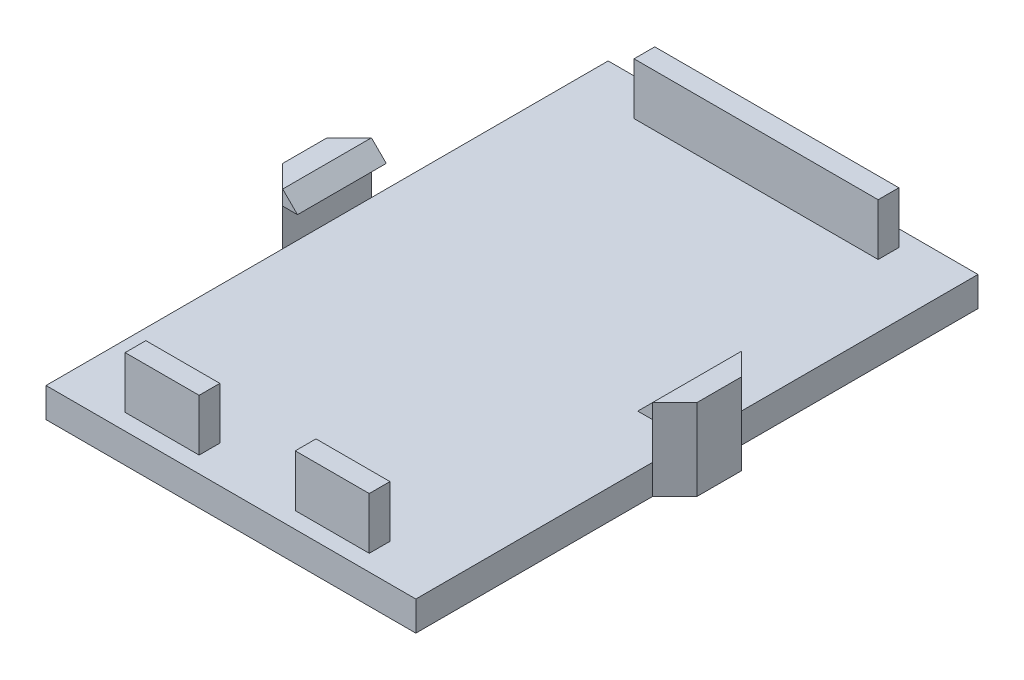
ISO-10303-21;
HEADER;
FILE_DESCRIPTION(('STEP AP214'),'2;1');
FILE_NAME('part.step','',(''),(''),'','','');
FILE_SCHEMA(('AUTOMOTIVE_DESIGN { 1 0 10303 214 1 1 1 1 }'));
ENDSEC;
DATA;
#1=APPLICATION_CONTEXT('core data for automotive mechanical design processes');
#2=APPLICATION_PROTOCOL_DEFINITION('international standard','automotive_design',2000,#1);
#3=PRODUCT_CONTEXT('',#1,'mechanical');
#4=PRODUCT('Part','Part','',(#3));
#5=PRODUCT_RELATED_PRODUCT_CATEGORY('part','',(#4));
#6=PRODUCT_DEFINITION_FORMATION('','',#4);
#7=PRODUCT_DEFINITION_CONTEXT('part definition',#1,'design');
#8=PRODUCT_DEFINITION('design','',#6,#7);
#9=PRODUCT_DEFINITION_SHAPE('','',#8);
#10=(LENGTH_UNIT() NAMED_UNIT(*) SI_UNIT(.MILLI.,.METRE.));
#11=(NAMED_UNIT(*) PLANE_ANGLE_UNIT() SI_UNIT($,.RADIAN.));
#12=(NAMED_UNIT(*) SI_UNIT($,.STERADIAN.) SOLID_ANGLE_UNIT());
#13=UNCERTAINTY_MEASURE_WITH_UNIT(LENGTH_MEASURE(1.E-05),#10,'distance_accuracy_value','');
#14=(GEOMETRIC_REPRESENTATION_CONTEXT(3) GLOBAL_UNCERTAINTY_ASSIGNED_CONTEXT((#13)) GLOBAL_UNIT_ASSIGNED_CONTEXT((#10,
#11,#12)) REPRESENTATION_CONTEXT('',''));
#15=CARTESIAN_POINT('',(0.,0.,0.));
#16=DIRECTION('',(0.,0.,1.));
#17=DIRECTION('',(1.,0.,0.));
#18=AXIS2_PLACEMENT_3D('',#15,#16,#17);
#19=CARTESIAN_POINT('',(0.,5.5,16.5));
#20=DIRECTION('',(0.,0.,-1.));
#21=DIRECTION('',(-1.,0.,0.));
#22=AXIS2_PLACEMENT_3D('',#19,#20,#21);
#23=PLANE('',#22);
#24=DIRECTION('',(1.,0.,0.));
#25=VECTOR('',#24,1.);
#26=CARTESIAN_POINT('',(0.,2.,16.5));
#27=LINE('',#26,#25);
#28=CARTESIAN_POINT('',(3.25,2.,16.5));
#29=VERTEX_POINT('',#28);
#30=CARTESIAN_POINT('',(8.25,2.,16.5));
#31=VERTEX_POINT('',#30);
#32=EDGE_CURVE('E448',#29,#31,#27,.T.);
#33=ORIENTED_EDGE('',*,*,#32,.F.);
#34=DIRECTION('',(0.,-1.,0.));
#35=VECTOR('',#34,1.);
#36=CARTESIAN_POINT('',(3.25,12.1490600839517,16.5));
#37=LINE('',#36,#35);
#38=CARTESIAN_POINT('',(3.25,5.5,16.5));
#39=VERTEX_POINT('',#38);
#40=EDGE_CURVE('E580',#39,#29,#37,.T.);
#41=ORIENTED_EDGE('',*,*,#40,.F.);
#42=DIRECTION('',(1.,0.,0.));
#43=VECTOR('',#42,1.);
#44=CARTESIAN_POINT('',(0.,5.5,16.5));
#45=LINE('',#44,#43);
#46=CARTESIAN_POINT('',(8.25,5.5,16.5));
#47=VERTEX_POINT('',#46);
#48=EDGE_CURVE('E568',#39,#47,#45,.T.);
#49=ORIENTED_EDGE('',*,*,#48,.T.);
#50=DIRECTION('',(0.,-1.,0.));
#51=VECTOR('',#50,1.);
#52=CARTESIAN_POINT('',(8.25,5.5,16.5));
#53=LINE('',#52,#51);
#54=EDGE_CURVE('E278',#47,#31,#53,.T.);
#55=ORIENTED_EDGE('',*,*,#54,.T.);
#56=EDGE_LOOP('',(#33,#41,#49,#55));
#57=FACE_BOUND('',#56,.T.);
#58=ADVANCED_FACE('F46',(#57),#23,.T.);
#59=CARTESIAN_POINT('',(-8.25,5.5,16.5));
#60=VERTEX_POINT('',#59);
#61=CARTESIAN_POINT('',(-3.25,5.5,16.5));
#62=VERTEX_POINT('',#61);
#63=EDGE_CURVE('E570',#60,#62,#45,.T.);
#64=ORIENTED_EDGE('',*,*,#63,.T.);
#65=DIRECTION('',(0.,-1.,0.));
#66=VECTOR('',#65,1.);
#67=CARTESIAN_POINT('',(-3.25,12.1490600839517,16.5));
#68=LINE('',#67,#66);
#69=CARTESIAN_POINT('',(-3.25,2.,16.5));
#70=VERTEX_POINT('',#69);
#71=EDGE_CURVE('E66',#62,#70,#68,.T.);
#72=ORIENTED_EDGE('',*,*,#71,.T.);
#73=CARTESIAN_POINT('',(-8.25,2.,16.5));
#74=VERTEX_POINT('',#73);
#75=EDGE_CURVE('E449',#74,#70,#27,.T.);
#76=ORIENTED_EDGE('',*,*,#75,.F.);
#77=DIRECTION('',(0.,-1.,0.));
#78=VECTOR('',#77,1.);
#79=CARTESIAN_POINT('',(-8.25,5.5,16.5));
#80=LINE('',#79,#78);
#81=EDGE_CURVE('E293',#60,#74,#80,.T.);
#82=ORIENTED_EDGE('',*,*,#81,.F.);
#83=EDGE_LOOP('',(#64,#72,#76,#82));
#84=FACE_BOUND('',#83,.T.);
#85=ADVANCED_FACE('F662',(#84),#23,.T.);
#86=CARTESIAN_POINT('',(0.,5.5,17.9));
#87=DIRECTION('',(0.,0.,-1.));
#88=DIRECTION('',(-1.,0.,0.));
#89=AXIS2_PLACEMENT_3D('',#86,#87,#88);
#90=PLANE('',#89);
#91=DIRECTION('',(0.,-1.,0.));
#92=VECTOR('',#91,1.);
#93=CARTESIAN_POINT('',(3.25,12.1490600839517,17.9));
#94=LINE('',#93,#92);
#95=CARTESIAN_POINT('',(3.25,5.5,17.9));
#96=VERTEX_POINT('',#95);
#97=CARTESIAN_POINT('',(3.25,2.,17.9));
#98=VERTEX_POINT('',#97);
#99=EDGE_CURVE('E930',#96,#98,#94,.T.);
#100=ORIENTED_EDGE('',*,*,#99,.T.);
#101=DIRECTION('',(1.,0.,0.));
#102=VECTOR('',#101,1.);
#103=CARTESIAN_POINT('',(0.,2.,17.9));
#104=LINE('',#103,#102);
#105=CARTESIAN_POINT('',(8.25,2.,17.9));
#106=VERTEX_POINT('',#105);
#107=EDGE_CURVE('E457',#98,#106,#104,.T.);
#108=ORIENTED_EDGE('',*,*,#107,.T.);
#109=DIRECTION('',(0.,-1.,0.));
#110=VECTOR('',#109,1.);
#111=CARTESIAN_POINT('',(8.25,5.5,17.9));
#112=LINE('',#111,#110);
#113=CARTESIAN_POINT('',(8.25,5.5,17.9));
#114=VERTEX_POINT('',#113);
#115=EDGE_CURVE('E286',#114,#106,#112,.T.);
#116=ORIENTED_EDGE('',*,*,#115,.F.);
#117=DIRECTION('',(1.,0.,0.));
#118=VECTOR('',#117,1.);
#119=CARTESIAN_POINT('',(0.,5.5,17.9));
#120=LINE('',#119,#118);
#121=EDGE_CURVE('E273',#96,#114,#120,.T.);
#122=ORIENTED_EDGE('',*,*,#121,.F.);
#123=EDGE_LOOP('',(#100,#108,#116,#122));
#124=FACE_BOUND('',#123,.T.);
#125=ADVANCED_FACE('F592',(#124),#90,.F.);
#126=DIRECTION('',(0.,-1.,0.));
#127=VECTOR('',#126,1.);
#128=CARTESIAN_POINT('',(-3.25,12.1490600839517,17.9));
#129=LINE('',#128,#127);
#130=CARTESIAN_POINT('',(-3.25,5.5,17.9));
#131=VERTEX_POINT('',#130);
#132=CARTESIAN_POINT('',(-3.25,2.,17.9));
#133=VERTEX_POINT('',#132);
#134=EDGE_CURVE('E246',#131,#133,#129,.T.);
#135=ORIENTED_EDGE('',*,*,#134,.F.);
#136=CARTESIAN_POINT('',(-8.25,5.5,17.9));
#137=VERTEX_POINT('',#136);
#138=EDGE_CURVE('E261',#137,#131,#120,.T.);
#139=ORIENTED_EDGE('',*,*,#138,.F.);
#140=DIRECTION('',(0.,-1.,0.));
#141=VECTOR('',#140,1.);
#142=CARTESIAN_POINT('',(-8.25,5.5,17.9));
#143=LINE('',#142,#141);
#144=CARTESIAN_POINT('',(-8.25,2.,17.9));
#145=VERTEX_POINT('',#144);
#146=EDGE_CURVE('E290',#137,#145,#143,.T.);
#147=ORIENTED_EDGE('',*,*,#146,.T.);
#148=EDGE_CURVE('E263',#145,#133,#104,.T.);
#149=ORIENTED_EDGE('',*,*,#148,.T.);
#150=EDGE_LOOP('',(#135,#139,#147,#149));
#151=FACE_BOUND('',#150,.T.);
#152=ADVANCED_FACE('F259',(#151),#90,.F.);
#153=CARTESIAN_POINT('',(0.,5.5,0.));
#154=DIRECTION('',(0.,1.,0.));
#155=DIRECTION('',(0.,0.,1.));
#156=AXIS2_PLACEMENT_3D('',#153,#154,#155);
#157=PLANE('',#156);
#158=ORIENTED_EDGE('',*,*,#48,.F.);
#159=DIRECTION('',(0.,0.,-1.));
#160=VECTOR('',#159,1.);
#161=CARTESIAN_POINT('',(3.25,5.5,17.9));
#162=LINE('',#161,#160);
#163=EDGE_CURVE('E254',#96,#39,#162,.T.);
#164=ORIENTED_EDGE('',*,*,#163,.F.);
#165=ORIENTED_EDGE('',*,*,#121,.T.);
#166=DIRECTION('',(0.,0.,1.));
#167=VECTOR('',#166,1.);
#168=CARTESIAN_POINT('',(8.25,5.5,0.));
#169=LINE('',#168,#167);
#170=EDGE_CURVE('E272',#47,#114,#169,.T.);
#171=ORIENTED_EDGE('',*,*,#170,.F.);
#172=EDGE_LOOP('',(#158,#164,#165,#171));
#173=FACE_BOUND('',#172,.T.);
#174=ADVANCED_FACE('F587',(#173),#157,.T.);
#175=ORIENTED_EDGE('',*,*,#138,.T.);
#176=DIRECTION('',(0.,0.,1.));
#177=VECTOR('',#176,1.);
#178=CARTESIAN_POINT('',(-3.25,5.5,17.9));
#179=LINE('',#178,#177);
#180=EDGE_CURVE('E243',#62,#131,#179,.T.);
#181=ORIENTED_EDGE('',*,*,#180,.F.);
#182=ORIENTED_EDGE('',*,*,#63,.F.);
#183=DIRECTION('',(0.,0.,1.));
#184=VECTOR('',#183,1.);
#185=CARTESIAN_POINT('',(-8.25,5.5,0.));
#186=LINE('',#185,#184);
#187=EDGE_CURVE('E269',#60,#137,#186,.T.);
#188=ORIENTED_EDGE('',*,*,#187,.T.);
#189=EDGE_LOOP('',(#175,#181,#182,#188));
#190=FACE_BOUND('',#189,.T.);
#191=ADVANCED_FACE('F267',(#190),#157,.T.);
#192=CARTESIAN_POINT('',(-12.5,5.5,0.));
#193=DIRECTION('',(-1.,0.,0.));
#194=DIRECTION('',(0.,0.,1.));
#195=AXIS2_PLACEMENT_3D('',#192,#193,#194);
#196=PLANE('',#195);
#197=DIRECTION('',(0.,0.,-1.));
#198=VECTOR('',#197,1.);
#199=CARTESIAN_POINT('',(-12.5,4.5,2.99999999999999));
#200=LINE('',#199,#198);
#201=CARTESIAN_POINT('',(-12.5,4.5,2.99999999999999));
#202=VERTEX_POINT('',#201);
#203=CARTESIAN_POINT('',(-12.5,4.5,-3.));
#204=VERTEX_POINT('',#203);
#205=EDGE_CURVE('E253',#202,#204,#200,.T.);
#206=ORIENTED_EDGE('',*,*,#205,.F.);
#207=DIRECTION('',(0.,-1.,0.));
#208=VECTOR('',#207,1.);
#209=CARTESIAN_POINT('',(-12.5,5.5,2.99999999999999));
#210=LINE('',#209,#208);
#211=CARTESIAN_POINT('',(-12.5,2.,2.99999999999999));
#212=VERTEX_POINT('',#211);
#213=EDGE_CURVE('E382',#202,#212,#210,.T.);
#214=ORIENTED_EDGE('',*,*,#213,.T.);
#215=DIRECTION('',(0.,0.,-1.));
#216=VECTOR('',#215,1.);
#217=CARTESIAN_POINT('',(-12.5,2.,0.));
#218=LINE('',#217,#216);
#219=CARTESIAN_POINT('',(-12.5,2.,-2.99999999999999));
#220=VERTEX_POINT('',#219);
#221=EDGE_CURVE('E445',#212,#220,#218,.T.);
#222=ORIENTED_EDGE('',*,*,#221,.T.);
#223=DIRECTION('',(0.,-1.,0.));
#224=VECTOR('',#223,1.);
#225=CARTESIAN_POINT('',(-12.5,5.5,-2.99999999999999));
#226=LINE('',#225,#224);
#227=EDGE_CURVE('E403',#204,#220,#226,.T.);
#228=ORIENTED_EDGE('',*,*,#227,.F.);
#229=EDGE_LOOP('',(#206,#214,#222,#228));
#230=FACE_BOUND('',#229,.T.);
#231=ADVANCED_FACE('F503',(#230),#196,.F.);
#232=CARTESIAN_POINT('',(12.5,5.5,0.));
#233=DIRECTION('',(-1.,0.,0.));
#234=DIRECTION('',(0.,0.,1.));
#235=AXIS2_PLACEMENT_3D('',#232,#233,#234);
#236=PLANE('',#235);
#237=DIRECTION('',(0.,-1.,0.));
#238=VECTOR('',#237,1.);
#239=CARTESIAN_POINT('',(12.5,5.5,2.99999999999999));
#240=LINE('',#239,#238);
#241=CARTESIAN_POINT('',(12.5,4.5,2.99999999999999));
#242=VERTEX_POINT('',#241);
#243=CARTESIAN_POINT('',(12.5,2.,2.99999999999999));
#244=VERTEX_POINT('',#243);
#245=EDGE_CURVE('E59',#242,#244,#240,.T.);
#246=ORIENTED_EDGE('',*,*,#245,.F.);
#247=DIRECTION('',(0.,0.,-1.));
#248=VECTOR('',#247,1.);
#249=CARTESIAN_POINT('',(12.5,4.5,2.99999999999999));
#250=LINE('',#249,#248);
#251=CARTESIAN_POINT('',(12.5,4.5,-3.));
#252=VERTEX_POINT('',#251);
#253=EDGE_CURVE('E559',#242,#252,#250,.T.);
#254=ORIENTED_EDGE('',*,*,#253,.T.);
#255=DIRECTION('',(0.,-1.,0.));
#256=VECTOR('',#255,1.);
#257=CARTESIAN_POINT('',(12.5,5.5,-3.));
#258=LINE('',#257,#256);
#259=CARTESIAN_POINT('',(12.5,2.,-3.));
#260=VERTEX_POINT('',#259);
#261=EDGE_CURVE('E344',#252,#260,#258,.T.);
#262=ORIENTED_EDGE('',*,*,#261,.T.);
#263=DIRECTION('',(0.,0.,-1.));
#264=VECTOR('',#263,1.);
#265=CARTESIAN_POINT('',(12.5,2.,0.));
#266=LINE('',#265,#264);
#267=EDGE_CURVE('E435',#244,#260,#266,.T.);
#268=ORIENTED_EDGE('',*,*,#267,.F.);
#269=EDGE_LOOP('',(#246,#254,#262,#268));
#270=FACE_BOUND('',#269,.T.);
#271=ADVANCED_FACE('F701',(#270),#236,.T.);
#272=CARTESIAN_POINT('',(12.5,2.,0.));
#273=DIRECTION('',(-1.,0.,0.));
#274=DIRECTION('',(0.,0.,1.));
#275=AXIS2_PLACEMENT_3D('',#272,#273,#274);
#276=PLANE('',#275);
#277=CARTESIAN_POINT('',(12.5,0.,2.99999999999999));
#278=VERTEX_POINT('',#277);
#279=EDGE_CURVE('E11',#244,#278,#240,.T.);
#280=ORIENTED_EDGE('',*,*,#279,.F.);
#281=CARTESIAN_POINT('',(12.5,2.,19.));
#282=VERTEX_POINT('',#281);
#283=EDGE_CURVE('E430',#282,#244,#266,.T.);
#284=ORIENTED_EDGE('',*,*,#283,.F.);
#285=DIRECTION('',(0.,-1.,0.));
#286=VECTOR('',#285,1.);
#287=CARTESIAN_POINT('',(12.5,2.,19.));
#288=LINE('',#287,#286);
#289=CARTESIAN_POINT('',(12.5,0.,19.));
#290=VERTEX_POINT('',#289);
#291=EDGE_CURVE('E50',#282,#290,#288,.T.);
#292=ORIENTED_EDGE('',*,*,#291,.T.);
#293=DIRECTION('',(0.,0.,-1.));
#294=VECTOR('',#293,1.);
#295=CARTESIAN_POINT('',(12.5,0.,0.));
#296=LINE('',#295,#294);
#297=EDGE_CURVE('E465',#290,#278,#296,.T.);
#298=ORIENTED_EDGE('',*,*,#297,.T.);
#299=EDGE_LOOP('',(#280,#284,#292,#298));
#300=FACE_BOUND('',#299,.T.);
#301=ADVANCED_FACE('F523',(#300),#276,.F.);
#302=CARTESIAN_POINT('',(-12.5,2.,0.));
#303=DIRECTION('',(-1.,0.,0.));
#304=DIRECTION('',(0.,0.,1.));
#305=AXIS2_PLACEMENT_3D('',#302,#303,#304);
#306=PLANE('',#305);
#307=CARTESIAN_POINT('',(-12.5,2.,19.));
#308=VERTEX_POINT('',#307);
#309=EDGE_CURVE('E440',#308,#212,#218,.T.);
#310=ORIENTED_EDGE('',*,*,#309,.T.);
#311=CARTESIAN_POINT('',(-12.5,0.,2.99999999999999));
#312=VERTEX_POINT('',#311);
#313=EDGE_CURVE('E396',#212,#312,#210,.T.);
#314=ORIENTED_EDGE('',*,*,#313,.T.);
#315=DIRECTION('',(0.,0.,-1.));
#316=VECTOR('',#315,1.);
#317=CARTESIAN_POINT('',(-12.5,0.,0.));
#318=LINE('',#317,#316);
#319=CARTESIAN_POINT('',(-12.5,0.,19.));
#320=VERTEX_POINT('',#319);
#321=EDGE_CURVE('E414',#320,#312,#318,.T.);
#322=ORIENTED_EDGE('',*,*,#321,.F.);
#323=DIRECTION('',(0.,-1.,0.));
#324=VECTOR('',#323,1.);
#325=CARTESIAN_POINT('',(-12.5,2.,19.));
#326=LINE('',#325,#324);
#327=EDGE_CURVE('E460',#308,#320,#326,.T.);
#328=ORIENTED_EDGE('',*,*,#327,.F.);
#329=EDGE_LOOP('',(#310,#314,#322,#328));
#330=FACE_BOUND('',#329,.T.);
#331=ADVANCED_FACE('F517',(#330),#306,.T.);
#332=CARTESIAN_POINT('',(0.,2.,19.));
#333=DIRECTION('',(0.,0.,-1.));
#334=DIRECTION('',(-1.,0.,0.));
#335=AXIS2_PLACEMENT_3D('',#332,#333,#334);
#336=PLANE('',#335);
#337=DIRECTION('',(1.,0.,0.));
#338=VECTOR('',#337,1.);
#339=CARTESIAN_POINT('',(0.,0.,19.));
#340=LINE('',#339,#338);
#341=EDGE_CURVE('E408',#320,#290,#340,.T.);
#342=ORIENTED_EDGE('',*,*,#341,.T.);
#343=ORIENTED_EDGE('',*,*,#291,.F.);
#344=DIRECTION('',(1.,0.,0.));
#345=VECTOR('',#344,1.);
#346=CARTESIAN_POINT('',(0.,2.,19.));
#347=LINE('',#346,#345);
#348=EDGE_CURVE('E425',#308,#282,#347,.T.);
#349=ORIENTED_EDGE('',*,*,#348,.F.);
#350=ORIENTED_EDGE('',*,*,#327,.T.);
#351=EDGE_LOOP('',(#342,#343,#349,#350));
#352=FACE_BOUND('',#351,.T.);
#353=ADVANCED_FACE('F48',(#352),#336,.F.);
#354=CARTESIAN_POINT('',(12.5,2.,-19.));
#355=VERTEX_POINT('',#354);
#356=EDGE_CURVE('E429',#260,#355,#266,.T.);
#357=ORIENTED_EDGE('',*,*,#356,.F.);
#358=CARTESIAN_POINT('',(12.5,0.,-3.));
#359=VERTEX_POINT('',#358);
#360=EDGE_CURVE('E56',#260,#359,#258,.T.);
#361=ORIENTED_EDGE('',*,*,#360,.T.);
#362=CARTESIAN_POINT('',(12.5,0.,-19.));
#363=VERTEX_POINT('',#362);
#364=EDGE_CURVE('E464',#359,#363,#296,.T.);
#365=ORIENTED_EDGE('',*,*,#364,.T.);
#366=DIRECTION('',(0.,-1.,0.));
#367=VECTOR('',#366,1.);
#368=CARTESIAN_POINT('',(12.5,2.,-19.));
#369=LINE('',#368,#367);
#370=EDGE_CURVE('E482',#355,#363,#369,.T.);
#371=ORIENTED_EDGE('',*,*,#370,.F.);
#372=EDGE_LOOP('',(#357,#361,#365,#371));
#373=FACE_BOUND('',#372,.T.);
#374=ADVANCED_FACE('F642',(#373),#276,.F.);
#375=CARTESIAN_POINT('',(0.,2.,-19.));
#376=DIRECTION('',(0.,0.,-1.));
#377=DIRECTION('',(-1.,0.,0.));
#378=AXIS2_PLACEMENT_3D('',#375,#376,#377);
#379=PLANE('',#378);
#380=DIRECTION('',(1.,0.,0.));
#381=VECTOR('',#380,1.);
#382=CARTESIAN_POINT('',(0.,0.,-19.));
#383=LINE('',#382,#381);
#384=CARTESIAN_POINT('',(-12.5,0.,-19.));
#385=VERTEX_POINT('',#384);
#386=EDGE_CURVE('E469',#385,#363,#383,.T.);
#387=ORIENTED_EDGE('',*,*,#386,.F.);
#388=DIRECTION('',(0.,-1.,0.));
#389=VECTOR('',#388,1.);
#390=CARTESIAN_POINT('',(-12.5,2.,-19.));
#391=LINE('',#390,#389);
#392=CARTESIAN_POINT('',(-12.5,2.,-19.));
#393=VERTEX_POINT('',#392);
#394=EDGE_CURVE('E479',#393,#385,#391,.T.);
#395=ORIENTED_EDGE('',*,*,#394,.F.);
#396=DIRECTION('',(1.,0.,0.));
#397=VECTOR('',#396,1.);
#398=CARTESIAN_POINT('',(0.,2.,-19.));
#399=LINE('',#398,#397);
#400=EDGE_CURVE('E434',#393,#355,#399,.T.);
#401=ORIENTED_EDGE('',*,*,#400,.T.);
#402=ORIENTED_EDGE('',*,*,#370,.T.);
#403=EDGE_LOOP('',(#387,#395,#401,#402));
#404=FACE_BOUND('',#403,.T.);
#405=ADVANCED_FACE('F645',(#404),#379,.T.);
#406=CARTESIAN_POINT('',(-12.5,0.,-2.99999999999999));
#407=VERTEX_POINT('',#406);
#408=EDGE_CURVE('E409',#220,#407,#226,.T.);
#409=ORIENTED_EDGE('',*,*,#408,.F.);
#410=EDGE_CURVE('E439',#220,#393,#218,.T.);
#411=ORIENTED_EDGE('',*,*,#410,.T.);
#412=ORIENTED_EDGE('',*,*,#394,.T.);
#413=EDGE_CURVE('E473',#407,#385,#318,.T.);
#414=ORIENTED_EDGE('',*,*,#413,.F.);
#415=EDGE_LOOP('',(#409,#411,#412,#414));
#416=FACE_BOUND('',#415,.T.);
#417=ADVANCED_FACE('F647',(#416),#306,.T.);
#418=CARTESIAN_POINT('',(0.,2.,0.));
#419=DIRECTION('',(0.,1.,0.));
#420=DIRECTION('',(0.,0.,1.));
#421=AXIS2_PLACEMENT_3D('',#418,#419,#420);
#422=PLANE('',#421);
#423=ORIENTED_EDGE('',*,*,#75,.T.);
#424=DIRECTION('',(0.,0.,1.));
#425=VECTOR('',#424,1.);
#426=CARTESIAN_POINT('',(-3.25,2.,17.9));
#427=LINE('',#426,#425);
#428=EDGE_CURVE('E265',#70,#133,#427,.T.);
#429=ORIENTED_EDGE('',*,*,#428,.T.);
#430=ORIENTED_EDGE('',*,*,#148,.F.);
#431=DIRECTION('',(0.,0.,1.));
#432=VECTOR('',#431,1.);
#433=CARTESIAN_POINT('',(-8.25,2.,0.));
#434=LINE('',#433,#432);
#435=EDGE_CURVE('E444',#74,#145,#434,.T.);
#436=ORIENTED_EDGE('',*,*,#435,.F.);
#437=EDGE_LOOP('',(#423,#429,#430,#436));
#438=FACE_BOUND('',#437,.T.);
#439=DIRECTION('',(0.,0.,-1.));
#440=VECTOR('',#439,1.);
#441=CARTESIAN_POINT('',(8.25,2.,0.));
#442=LINE('',#441,#440);
#443=CARTESIAN_POINT('',(8.25,2.,-16.5));
#444=VERTEX_POINT('',#443);
#445=CARTESIAN_POINT('',(8.25,2.,-17.9));
#446=VERTEX_POINT('',#445);
#447=EDGE_CURVE('E410',#444,#446,#442,.T.);
#448=ORIENTED_EDGE('',*,*,#447,.F.);
#449=DIRECTION('',(1.,0.,0.));
#450=VECTOR('',#449,1.);
#451=CARTESIAN_POINT('',(0.,2.,-16.5));
#452=LINE('',#451,#450);
#453=CARTESIAN_POINT('',(-8.25,2.,-16.5));
#454=VERTEX_POINT('',#453);
#455=EDGE_CURVE('E413',#454,#444,#452,.T.);
#456=ORIENTED_EDGE('',*,*,#455,.F.);
#457=DIRECTION('',(0.,0.,-1.));
#458=VECTOR('',#457,1.);
#459=CARTESIAN_POINT('',(-8.25,2.,0.));
#460=LINE('',#459,#458);
#461=CARTESIAN_POINT('',(-8.25,2.,-17.9));
#462=VERTEX_POINT('',#461);
#463=EDGE_CURVE('E417',#454,#462,#460,.T.);
#464=ORIENTED_EDGE('',*,*,#463,.T.);
#465=DIRECTION('',(1.,0.,0.));
#466=VECTOR('',#465,1.);
#467=CARTESIAN_POINT('',(0.,2.,-17.9));
#468=LINE('',#467,#466);
#469=EDGE_CURVE('E421',#462,#446,#468,.T.);
#470=ORIENTED_EDGE('',*,*,#469,.T.);
#471=EDGE_LOOP('',(#448,#456,#464,#470));
#472=FACE_BOUND('',#471,.T.);
#473=ORIENTED_EDGE('',*,*,#348,.T.);
#474=ORIENTED_EDGE('',*,*,#283,.T.);
#475=ORIENTED_EDGE('',*,*,#267,.T.);
#476=ORIENTED_EDGE('',*,*,#356,.T.);
#477=ORIENTED_EDGE('',*,*,#400,.F.);
#478=ORIENTED_EDGE('',*,*,#410,.F.);
#479=ORIENTED_EDGE('',*,*,#221,.F.);
#480=ORIENTED_EDGE('',*,*,#309,.F.);
#481=EDGE_LOOP('',(#473,#474,#475,#476,#477,#478,#479,#480));
#482=FACE_BOUND('',#481,.T.);
#483=DIRECTION('',(0.,0.,-1.));
#484=VECTOR('',#483,1.);
#485=CARTESIAN_POINT('',(3.25,2.,17.9));
#486=LINE('',#485,#484);
#487=EDGE_CURVE('E595',#98,#29,#486,.T.);
#488=ORIENTED_EDGE('',*,*,#487,.T.);
#489=ORIENTED_EDGE('',*,*,#32,.T.);
#490=DIRECTION('',(0.,0.,1.));
#491=VECTOR('',#490,1.);
#492=CARTESIAN_POINT('',(8.25,2.,0.));
#493=LINE('',#492,#491);
#494=EDGE_CURVE('E453',#31,#106,#493,.T.);
#495=ORIENTED_EDGE('',*,*,#494,.T.);
#496=ORIENTED_EDGE('',*,*,#107,.F.);
#497=EDGE_LOOP('',(#488,#489,#495,#496));
#498=FACE_BOUND('',#497,.T.);
#499=ADVANCED_FACE('F513',(#438,#472,#482,#498),#422,.T.);
#500=CARTESIAN_POINT('',(0.,0.,0.));
#501=DIRECTION('',(0.,1.,0.));
#502=DIRECTION('',(0.,0.,1.));
#503=AXIS2_PLACEMENT_3D('',#500,#501,#502);
#504=PLANE('',#503);
#505=ORIENTED_EDGE('',*,*,#341,.F.);
#506=ORIENTED_EDGE('',*,*,#321,.T.);
#507=DIRECTION('',(-0.707106781186544,0.,-0.707106781186551));
#508=VECTOR('',#507,1.);
#509=CARTESIAN_POINT('',(-7.75000000000006,0.,7.74999999999998));
#510=LINE('',#509,#508);
#511=CARTESIAN_POINT('',(-14.,0.,1.49999999999998));
#512=VERTEX_POINT('',#511);
#513=EDGE_CURVE('E372',#312,#512,#510,.T.);
#514=ORIENTED_EDGE('',*,*,#513,.T.);
#515=DIRECTION('',(0.,0.,1.));
#516=VECTOR('',#515,1.);
#517=CARTESIAN_POINT('',(-14.,0.,0.));
#518=LINE('',#517,#516);
#519=CARTESIAN_POINT('',(-14.,0.,-1.49999999999998));
#520=VERTEX_POINT('',#519);
#521=EDGE_CURVE('E385',#520,#512,#518,.T.);
#522=ORIENTED_EDGE('',*,*,#521,.F.);
#523=DIRECTION('',(-0.707106781186544,0.,0.707106781186551));
#524=VECTOR('',#523,1.);
#525=CARTESIAN_POINT('',(-7.75000000000007,0.,-7.74999999999998));
#526=LINE('',#525,#524);
#527=EDGE_CURVE('E366',#407,#520,#526,.T.);
#528=ORIENTED_EDGE('',*,*,#527,.F.);
#529=ORIENTED_EDGE('',*,*,#413,.T.);
#530=ORIENTED_EDGE('',*,*,#386,.T.);
#531=ORIENTED_EDGE('',*,*,#364,.F.);
#532=DIRECTION('',(0.707106781186544,0.,0.707106781186551));
#533=VECTOR('',#532,1.);
#534=CARTESIAN_POINT('',(7.75000000000007,0.,-7.74999999999998));
#535=LINE('',#534,#533);
#536=CARTESIAN_POINT('',(14.,0.,-1.49999999999998));
#537=VERTEX_POINT('',#536);
#538=EDGE_CURVE('E333',#359,#537,#535,.T.);
#539=ORIENTED_EDGE('',*,*,#538,.T.);
#540=DIRECTION('',(0.,0.,1.));
#541=VECTOR('',#540,1.);
#542=CARTESIAN_POINT('',(14.,0.,0.));
#543=LINE('',#542,#541);
#544=CARTESIAN_POINT('',(14.,0.,1.49999999999998));
#545=VERTEX_POINT('',#544);
#546=EDGE_CURVE('E348',#537,#545,#543,.T.);
#547=ORIENTED_EDGE('',*,*,#546,.T.);
#548=DIRECTION('',(0.707106781186544,0.,-0.707106781186551));
#549=VECTOR('',#548,1.);
#550=CARTESIAN_POINT('',(7.75000000000006,0.,7.74999999999998));
#551=LINE('',#550,#549);
#552=EDGE_CURVE('E327',#278,#545,#551,.T.);
#553=ORIENTED_EDGE('',*,*,#552,.F.);
#554=ORIENTED_EDGE('',*,*,#297,.F.);
#555=EDGE_LOOP('',(#505,#506,#514,#522,#528,#529,#530,#531,#539,#547,#553,#554));
#556=FACE_BOUND('',#555,.T.);
#557=ADVANCED_FACE('F529',(#556),#504,.F.);
#558=CARTESIAN_POINT('',(-7.75000000000007,5.5,-7.74999999999998));
#559=DIRECTION('',(0.707106781186551,0.,0.707106781186544));
#560=DIRECTION('',(0.707106781186544,0.,-0.707106781186551));
#561=AXIS2_PLACEMENT_3D('',#558,#559,#560);
#562=PLANE('',#561);
#563=ORIENTED_EDGE('',*,*,#527,.T.);
#564=DIRECTION('',(0.,-1.,0.));
#565=VECTOR('',#564,1.);
#566=CARTESIAN_POINT('',(-14.,5.5,-1.49999999999998));
#567=LINE('',#566,#565);
#568=CARTESIAN_POINT('',(-14.,5.5,-1.49999999999998));
#569=VERTEX_POINT('',#568);
#570=EDGE_CURVE('E399',#569,#520,#567,.T.);
#571=ORIENTED_EDGE('',*,*,#570,.F.);
#572=DIRECTION('',(-0.707106781186544,0.,0.707106781186551));
#573=VECTOR('',#572,1.);
#574=CARTESIAN_POINT('',(-7.75000000000007,5.5,-7.74999999999998));
#575=LINE('',#574,#573);
#576=CARTESIAN_POINT('',(-12.5,5.5,-2.99999999999999));
#577=VERTEX_POINT('',#576);
#578=EDGE_CURVE('E371',#577,#569,#575,.T.);
#579=ORIENTED_EDGE('',*,*,#578,.F.);
#580=EDGE_CURVE('E404',#577,#204,#226,.T.);
#581=ORIENTED_EDGE('',*,*,#580,.T.);
#582=ORIENTED_EDGE('',*,*,#227,.T.);
#583=ORIENTED_EDGE('',*,*,#408,.T.);
#584=EDGE_LOOP('',(#563,#571,#579,#581,#582,#583));
#585=FACE_BOUND('',#584,.T.);
#586=ADVANCED_FACE('F604',(#585),#562,.F.);
#587=CARTESIAN_POINT('',(-14.,5.5,0.));
#588=DIRECTION('',(1.,0.,0.));
#589=DIRECTION('',(0.,0.,-1.));
#590=AXIS2_PLACEMENT_3D('',#587,#588,#589);
#591=PLANE('',#590);
#592=ORIENTED_EDGE('',*,*,#521,.T.);
#593=DIRECTION('',(0.,-1.,0.));
#594=VECTOR('',#593,1.);
#595=CARTESIAN_POINT('',(-14.,5.5,1.49999999999998));
#596=LINE('',#595,#594);
#597=CARTESIAN_POINT('',(-14.,5.5,1.49999999999998));
#598=VERTEX_POINT('',#597);
#599=EDGE_CURVE('E395',#598,#512,#596,.T.);
#600=ORIENTED_EDGE('',*,*,#599,.F.);
#601=DIRECTION('',(0.,0.,1.));
#602=VECTOR('',#601,1.);
#603=CARTESIAN_POINT('',(-14.,5.5,0.));
#604=LINE('',#603,#602);
#605=EDGE_CURVE('E375',#569,#598,#604,.T.);
#606=ORIENTED_EDGE('',*,*,#605,.F.);
#607=ORIENTED_EDGE('',*,*,#570,.T.);
#608=EDGE_LOOP('',(#592,#600,#606,#607));
#609=FACE_BOUND('',#608,.T.);
#610=ADVANCED_FACE('F709',(#609),#591,.F.);
#611=CARTESIAN_POINT('',(-7.75000000000006,5.5,7.74999999999998));
#612=DIRECTION('',(-0.707106781186551,0.,0.707106781186544));
#613=DIRECTION('',(0.707106781186544,0.,0.707106781186551));
#614=AXIS2_PLACEMENT_3D('',#611,#612,#613);
#615=PLANE('',#614);
#616=ORIENTED_EDGE('',*,*,#513,.F.);
#617=ORIENTED_EDGE('',*,*,#313,.F.);
#618=ORIENTED_EDGE('',*,*,#213,.F.);
#619=CARTESIAN_POINT('',(-12.5,5.5,2.99999999999999));
#620=VERTEX_POINT('',#619);
#621=EDGE_CURVE('E392',#620,#202,#210,.T.);
#622=ORIENTED_EDGE('',*,*,#621,.F.);
#623=DIRECTION('',(-0.707106781186544,0.,-0.707106781186551));
#624=VECTOR('',#623,1.);
#625=CARTESIAN_POINT('',(-7.75000000000006,5.5,7.74999999999998));
#626=LINE('',#625,#624);
#627=EDGE_CURVE('E378',#620,#598,#626,.T.);
#628=ORIENTED_EDGE('',*,*,#627,.T.);
#629=ORIENTED_EDGE('',*,*,#599,.T.);
#630=EDGE_LOOP('',(#616,#617,#618,#622,#628,#629));
#631=FACE_BOUND('',#630,.T.);
#632=ADVANCED_FACE('F509',(#631),#615,.T.);
#633=CARTESIAN_POINT('',(0.,5.5,0.));
#634=DIRECTION('',(0.,1.,0.));
#635=DIRECTION('',(0.,0.,1.));
#636=AXIS2_PLACEMENT_3D('',#633,#634,#635);
#637=PLANE('',#636);
#638=DIRECTION('',(0.,0.,-1.));
#639=VECTOR('',#638,1.);
#640=CARTESIAN_POINT('',(-12.5,5.5,0.));
#641=LINE('',#640,#639);
#642=EDGE_CURVE('E367',#620,#577,#641,.T.);
#643=ORIENTED_EDGE('',*,*,#642,.T.);
#644=ORIENTED_EDGE('',*,*,#578,.T.);
#645=ORIENTED_EDGE('',*,*,#605,.T.);
#646=ORIENTED_EDGE('',*,*,#627,.F.);
#647=EDGE_LOOP('',(#643,#644,#645,#646));
#648=FACE_BOUND('',#647,.T.);
#649=ADVANCED_FACE('F700',(#648),#637,.T.);
#650=CARTESIAN_POINT('',(7.75000000000006,5.5,7.74999999999998));
#651=DIRECTION('',(-0.707106781186551,0.,-0.707106781186544));
#652=DIRECTION('',(-0.707106781186544,0.,0.707106781186551));
#653=AXIS2_PLACEMENT_3D('',#650,#651,#652);
#654=PLANE('',#653);
#655=ORIENTED_EDGE('',*,*,#552,.T.);
#656=DIRECTION('',(0.,-1.,0.));
#657=VECTOR('',#656,1.);
#658=CARTESIAN_POINT('',(14.,5.5,1.49999999999998));
#659=LINE('',#658,#657);
#660=CARTESIAN_POINT('',(14.,5.5,1.49999999999998));
#661=VERTEX_POINT('',#660);
#662=EDGE_CURVE('E362',#661,#545,#659,.T.);
#663=ORIENTED_EDGE('',*,*,#662,.F.);
#664=DIRECTION('',(0.707106781186544,0.,-0.707106781186551));
#665=VECTOR('',#664,1.);
#666=CARTESIAN_POINT('',(7.75000000000006,5.5,7.74999999999998));
#667=LINE('',#666,#665);
#668=CARTESIAN_POINT('',(12.5,5.5,2.99999999999999));
#669=VERTEX_POINT('',#668);
#670=EDGE_CURVE('E332',#669,#661,#667,.T.);
#671=ORIENTED_EDGE('',*,*,#670,.F.);
#672=EDGE_CURVE('E58',#669,#242,#240,.T.);
#673=ORIENTED_EDGE('',*,*,#672,.T.);
#674=ORIENTED_EDGE('',*,*,#245,.T.);
#675=ORIENTED_EDGE('',*,*,#279,.T.);
#676=EDGE_LOOP('',(#655,#663,#671,#673,#674,#675));
#677=FACE_BOUND('',#676,.T.);
#678=ADVANCED_FACE('F526',(#677),#654,.F.);
#679=CARTESIAN_POINT('',(14.,5.5,0.));
#680=DIRECTION('',(1.,0.,0.));
#681=DIRECTION('',(0.,0.,-1.));
#682=AXIS2_PLACEMENT_3D('',#679,#680,#681);
#683=PLANE('',#682);
#684=ORIENTED_EDGE('',*,*,#546,.F.);
#685=DIRECTION('',(0.,-1.,0.));
#686=VECTOR('',#685,1.);
#687=CARTESIAN_POINT('',(14.,5.5,-1.49999999999998));
#688=LINE('',#687,#686);
#689=CARTESIAN_POINT('',(14.,5.5,-1.49999999999998));
#690=VERTEX_POINT('',#689);
#691=EDGE_CURVE('E359',#690,#537,#688,.T.);
#692=ORIENTED_EDGE('',*,*,#691,.F.);
#693=DIRECTION('',(0.,0.,1.));
#694=VECTOR('',#693,1.);
#695=CARTESIAN_POINT('',(14.,5.5,0.));
#696=LINE('',#695,#694);
#697=EDGE_CURVE('E336',#690,#661,#696,.T.);
#698=ORIENTED_EDGE('',*,*,#697,.T.);
#699=ORIENTED_EDGE('',*,*,#662,.T.);
#700=EDGE_LOOP('',(#684,#692,#698,#699));
#701=FACE_BOUND('',#700,.T.);
#702=ADVANCED_FACE('F533',(#701),#683,.T.);
#703=CARTESIAN_POINT('',(7.75000000000007,5.5,-7.74999999999998));
#704=DIRECTION('',(0.707106781186551,0.,-0.707106781186544));
#705=DIRECTION('',(-0.707106781186544,0.,-0.707106781186551));
#706=AXIS2_PLACEMENT_3D('',#703,#704,#705);
#707=PLANE('',#706);
#708=ORIENTED_EDGE('',*,*,#538,.F.);
#709=ORIENTED_EDGE('',*,*,#360,.F.);
#710=ORIENTED_EDGE('',*,*,#261,.F.);
#711=CARTESIAN_POINT('',(12.5,5.5,-3.));
#712=VERTEX_POINT('',#711);
#713=EDGE_CURVE('E355',#712,#252,#258,.T.);
#714=ORIENTED_EDGE('',*,*,#713,.F.);
#715=DIRECTION('',(0.707106781186544,0.,0.707106781186551));
#716=VECTOR('',#715,1.);
#717=CARTESIAN_POINT('',(7.75000000000007,5.5,-7.74999999999998));
#718=LINE('',#717,#716);
#719=EDGE_CURVE('E340',#712,#690,#718,.T.);
#720=ORIENTED_EDGE('',*,*,#719,.T.);
#721=ORIENTED_EDGE('',*,*,#691,.T.);
#722=EDGE_LOOP('',(#708,#709,#710,#714,#720,#721));
#723=FACE_BOUND('',#722,.T.);
#724=ADVANCED_FACE('F635',(#723),#707,.T.);
#725=CARTESIAN_POINT('',(0.,5.5,0.));
#726=DIRECTION('',(0.,1.,0.));
#727=DIRECTION('',(0.,0.,1.));
#728=AXIS2_PLACEMENT_3D('',#725,#726,#727);
#729=PLANE('',#728);
#730=DIRECTION('',(0.,0.,-1.));
#731=VECTOR('',#730,1.);
#732=CARTESIAN_POINT('',(12.5,5.5,0.));
#733=LINE('',#732,#731);
#734=EDGE_CURVE('E328',#669,#712,#733,.T.);
#735=ORIENTED_EDGE('',*,*,#734,.F.);
#736=ORIENTED_EDGE('',*,*,#670,.T.);
#737=ORIENTED_EDGE('',*,*,#697,.F.);
#738=ORIENTED_EDGE('',*,*,#719,.F.);
#739=EDGE_LOOP('',(#735,#736,#737,#738));
#740=FACE_BOUND('',#739,.T.);
#741=ADVANCED_FACE('F540',(#740),#729,.T.);
#742=CARTESIAN_POINT('',(0.,5.5,-16.5));
#743=DIRECTION('',(0.,0.,-1.));
#744=DIRECTION('',(-1.,0.,0.));
#745=AXIS2_PLACEMENT_3D('',#742,#743,#744);
#746=PLANE('',#745);
#747=ORIENTED_EDGE('',*,*,#455,.T.);
#748=DIRECTION('',(0.,-1.,0.));
#749=VECTOR('',#748,1.);
#750=CARTESIAN_POINT('',(8.25,5.5,-16.5));
#751=LINE('',#750,#749);
#752=CARTESIAN_POINT('',(8.25,5.5,-16.5));
#753=VERTEX_POINT('',#752);
#754=EDGE_CURVE('E323',#753,#444,#751,.T.);
#755=ORIENTED_EDGE('',*,*,#754,.F.);
#756=DIRECTION('',(1.,0.,0.));
#757=VECTOR('',#756,1.);
#758=CARTESIAN_POINT('',(0.,5.5,-16.5));
#759=LINE('',#758,#757);
#760=CARTESIAN_POINT('',(-8.25,5.5,-16.5));
#761=VERTEX_POINT('',#760);
#762=EDGE_CURVE('E297',#761,#753,#759,.T.);
#763=ORIENTED_EDGE('',*,*,#762,.F.);
#764=DIRECTION('',(0.,-1.,0.));
#765=VECTOR('',#764,1.);
#766=CARTESIAN_POINT('',(-8.25,5.5,-16.5));
#767=LINE('',#766,#765);
#768=EDGE_CURVE('E312',#761,#454,#767,.T.);
#769=ORIENTED_EDGE('',*,*,#768,.T.);
#770=EDGE_LOOP('',(#747,#755,#763,#769));
#771=FACE_BOUND('',#770,.T.);
#772=ADVANCED_FACE('F687',(#771),#746,.F.);
#773=CARTESIAN_POINT('',(8.25,5.5,0.));
#774=DIRECTION('',(-1.,0.,0.));
#775=DIRECTION('',(0.,0.,1.));
#776=AXIS2_PLACEMENT_3D('',#773,#774,#775);
#777=PLANE('',#776);
#778=ORIENTED_EDGE('',*,*,#447,.T.);
#779=DIRECTION('',(0.,-1.,0.));
#780=VECTOR('',#779,1.);
#781=CARTESIAN_POINT('',(8.25,5.5,-17.9));
#782=LINE('',#781,#780);
#783=CARTESIAN_POINT('',(8.25,5.5,-17.9));
#784=VERTEX_POINT('',#783);
#785=EDGE_CURVE('E319',#784,#446,#782,.T.);
#786=ORIENTED_EDGE('',*,*,#785,.F.);
#787=DIRECTION('',(0.,0.,-1.));
#788=VECTOR('',#787,1.);
#789=CARTESIAN_POINT('',(8.25,5.5,0.));
#790=LINE('',#789,#788);
#791=EDGE_CURVE('E301',#753,#784,#790,.T.);
#792=ORIENTED_EDGE('',*,*,#791,.F.);
#793=ORIENTED_EDGE('',*,*,#754,.T.);
#794=EDGE_LOOP('',(#778,#786,#792,#793));
#795=FACE_BOUND('',#794,.T.);
#796=ADVANCED_FACE('F683',(#795),#777,.F.);
#797=CARTESIAN_POINT('',(0.,5.5,-17.9));
#798=DIRECTION('',(0.,0.,-1.));
#799=DIRECTION('',(-1.,0.,0.));
#800=AXIS2_PLACEMENT_3D('',#797,#798,#799);
#801=PLANE('',#800);
#802=ORIENTED_EDGE('',*,*,#785,.T.);
#803=ORIENTED_EDGE('',*,*,#469,.F.);
#804=DIRECTION('',(0.,-1.,0.));
#805=VECTOR('',#804,1.);
#806=CARTESIAN_POINT('',(-8.25,5.5,-17.9));
#807=LINE('',#806,#805);
#808=CARTESIAN_POINT('',(-8.25,5.5,-17.9));
#809=VERTEX_POINT('',#808);
#810=EDGE_CURVE('E316',#809,#462,#807,.T.);
#811=ORIENTED_EDGE('',*,*,#810,.F.);
#812=DIRECTION('',(1.,0.,0.));
#813=VECTOR('',#812,1.);
#814=CARTESIAN_POINT('',(0.,5.5,-17.9));
#815=LINE('',#814,#813);
#816=EDGE_CURVE('E304',#809,#784,#815,.T.);
#817=ORIENTED_EDGE('',*,*,#816,.T.);
#818=EDGE_LOOP('',(#802,#803,#811,#817));
#819=FACE_BOUND('',#818,.T.);
#820=ADVANCED_FACE('F679',(#819),#801,.T.);
#821=CARTESIAN_POINT('',(-8.25,5.5,0.));
#822=DIRECTION('',(-1.,0.,0.));
#823=DIRECTION('',(0.,0.,1.));
#824=AXIS2_PLACEMENT_3D('',#821,#822,#823);
#825=PLANE('',#824);
#826=ORIENTED_EDGE('',*,*,#810,.T.);
#827=ORIENTED_EDGE('',*,*,#463,.F.);
#828=ORIENTED_EDGE('',*,*,#768,.F.);
#829=DIRECTION('',(0.,0.,-1.));
#830=VECTOR('',#829,1.);
#831=CARTESIAN_POINT('',(-8.25,5.5,0.));
#832=LINE('',#831,#830);
#833=EDGE_CURVE('E308',#761,#809,#832,.T.);
#834=ORIENTED_EDGE('',*,*,#833,.T.);
#835=EDGE_LOOP('',(#826,#827,#828,#834));
#836=FACE_BOUND('',#835,.T.);
#837=ADVANCED_FACE('F675',(#836),#825,.T.);
#838=CARTESIAN_POINT('',(0.,5.5,0.));
#839=DIRECTION('',(0.,1.,0.));
#840=DIRECTION('',(0.,0.,1.));
#841=AXIS2_PLACEMENT_3D('',#838,#839,#840);
#842=PLANE('',#841);
#843=ORIENTED_EDGE('',*,*,#762,.T.);
#844=ORIENTED_EDGE('',*,*,#791,.T.);
#845=ORIENTED_EDGE('',*,*,#816,.F.);
#846=ORIENTED_EDGE('',*,*,#833,.F.);
#847=EDGE_LOOP('',(#843,#844,#845,#846));
#848=FACE_BOUND('',#847,.T.);
#849=ADVANCED_FACE('F672',(#848),#842,.T.);
#850=CARTESIAN_POINT('',(-8.25,5.5,0.));
#851=DIRECTION('',(1.,0.,0.));
#852=DIRECTION('',(0.,0.,-1.));
#853=AXIS2_PLACEMENT_3D('',#850,#851,#852);
#854=PLANE('',#853);
#855=ORIENTED_EDGE('',*,*,#435,.T.);
#856=ORIENTED_EDGE('',*,*,#146,.F.);
#857=ORIENTED_EDGE('',*,*,#187,.F.);
#858=ORIENTED_EDGE('',*,*,#81,.T.);
#859=EDGE_LOOP('',(#855,#856,#857,#858));
#860=FACE_BOUND('',#859,.T.);
#861=ADVANCED_FACE('F670',(#860),#854,.F.);
#862=CARTESIAN_POINT('',(8.25,5.5,0.));
#863=DIRECTION('',(1.,0.,0.));
#864=DIRECTION('',(0.,0.,-1.));
#865=AXIS2_PLACEMENT_3D('',#862,#863,#864);
#866=PLANE('',#865);
#867=ORIENTED_EDGE('',*,*,#115,.T.);
#868=ORIENTED_EDGE('',*,*,#494,.F.);
#869=ORIENTED_EDGE('',*,*,#54,.F.);
#870=ORIENTED_EDGE('',*,*,#170,.T.);
#871=EDGE_LOOP('',(#867,#868,#869,#870));
#872=FACE_BOUND('',#871,.T.);
#873=ADVANCED_FACE('F586',(#872),#866,.T.);
#874=CARTESIAN_POINT('',(12.5,5.5,2.99999999999999));
#875=DIRECTION('',(0.707106781186547,-0.707106781186547,0.));
#876=DIRECTION('',(0.707106781186548,0.707106781186548,0.));
#877=AXIS2_PLACEMENT_3D('',#874,#875,#876);
#878=PLANE('',#877);
#879=ORIENTED_EDGE('',*,*,#734,.T.);
#880=DIRECTION('',(-0.707106781186548,-0.707106781186548,0.));
#881=VECTOR('',#880,1.);
#882=CARTESIAN_POINT('',(12.5,5.5,-3.));
#883=LINE('',#882,#881);
#884=CARTESIAN_POINT('',(11.5,4.5,-3.));
#885=VERTEX_POINT('',#884);
#886=EDGE_CURVE('E623',#712,#885,#883,.T.);
#887=ORIENTED_EDGE('',*,*,#886,.T.);
#888=DIRECTION('',(0.,0.,-1.));
#889=VECTOR('',#888,1.);
#890=CARTESIAN_POINT('',(11.5,4.5,2.99999999999999));
#891=LINE('',#890,#889);
#892=CARTESIAN_POINT('',(11.5,4.5,2.99999999999999));
#893=VERTEX_POINT('',#892);
#894=EDGE_CURVE('E548',#893,#885,#891,.T.);
#895=ORIENTED_EDGE('',*,*,#894,.F.);
#896=DIRECTION('',(-0.707106781186548,-0.707106781186548,0.));
#897=VECTOR('',#896,1.);
#898=CARTESIAN_POINT('',(12.5,5.5,2.99999999999999));
#899=LINE('',#898,#897);
#900=EDGE_CURVE('E546',#669,#893,#899,.T.);
#901=ORIENTED_EDGE('',*,*,#900,.F.);
#902=EDGE_LOOP('',(#879,#887,#895,#901));
#903=FACE_BOUND('',#902,.T.);
#904=ADVANCED_FACE('F547',(#903),#878,.F.);
#905=CARTESIAN_POINT('',(11.5,4.5,2.99999999999999));
#906=DIRECTION('',(0.,1.,0.));
#907=DIRECTION('',(0.,0.,1.));
#908=AXIS2_PLACEMENT_3D('',#905,#906,#907);
#909=PLANE('',#908);
#910=ORIENTED_EDGE('',*,*,#894,.T.);
#911=DIRECTION('',(1.,0.,0.));
#912=VECTOR('',#911,1.);
#913=CARTESIAN_POINT('',(11.5,4.5,-3.));
#914=LINE('',#913,#912);
#915=EDGE_CURVE('E553',#885,#252,#914,.T.);
#916=ORIENTED_EDGE('',*,*,#915,.T.);
#917=ORIENTED_EDGE('',*,*,#253,.F.);
#918=DIRECTION('',(1.,0.,0.));
#919=VECTOR('',#918,1.);
#920=CARTESIAN_POINT('',(11.5,4.5,2.99999999999999));
#921=LINE('',#920,#919);
#922=EDGE_CURVE('E552',#893,#242,#921,.T.);
#923=ORIENTED_EDGE('',*,*,#922,.F.);
#924=EDGE_LOOP('',(#910,#916,#917,#923));
#925=FACE_BOUND('',#924,.T.);
#926=ADVANCED_FACE('F562',(#925),#909,.F.);
#927=CARTESIAN_POINT('',(0.,0.,2.99999999999999));
#928=DIRECTION('',(0.,0.,-1.));
#929=DIRECTION('',(-1.,0.,0.));
#930=AXIS2_PLACEMENT_3D('',#927,#928,#929);
#931=PLANE('',#930);
#932=ORIENTED_EDGE('',*,*,#672,.F.);
#933=ORIENTED_EDGE('',*,*,#900,.T.);
#934=ORIENTED_EDGE('',*,*,#922,.T.);
#935=EDGE_LOOP('',(#932,#933,#934));
#936=FACE_BOUND('',#935,.T.);
#937=ADVANCED_FACE('F555',(#936),#931,.F.);
#938=CARTESIAN_POINT('',(0.,0.,-3.));
#939=DIRECTION('',(0.,0.,-1.));
#940=DIRECTION('',(-1.,0.,0.));
#941=AXIS2_PLACEMENT_3D('',#938,#939,#940);
#942=PLANE('',#941);
#943=ORIENTED_EDGE('',*,*,#713,.T.);
#944=ORIENTED_EDGE('',*,*,#915,.F.);
#945=ORIENTED_EDGE('',*,*,#886,.F.);
#946=EDGE_LOOP('',(#943,#944,#945));
#947=FACE_BOUND('',#946,.T.);
#948=ADVANCED_FACE('F633',(#947),#942,.T.);
#949=CARTESIAN_POINT('',(-12.5,5.5,2.99999999999999));
#950=DIRECTION('',(-0.707106781186547,-0.707106781186547,0.));
#951=DIRECTION('',(0.707106781186548,-0.707106781186548,0.));
#952=AXIS2_PLACEMENT_3D('',#949,#950,#951);
#953=PLANE('',#952);
#954=DIRECTION('',(0.,0.,-1.));
#955=VECTOR('',#954,1.);
#956=CARTESIAN_POINT('',(-11.5,4.5,2.99999999999999));
#957=LINE('',#956,#955);
#958=CARTESIAN_POINT('',(-11.5,4.5,2.99999999999999));
#959=VERTEX_POINT('',#958);
#960=CARTESIAN_POINT('',(-11.5,4.5,-3.));
#961=VERTEX_POINT('',#960);
#962=EDGE_CURVE('E943',#959,#961,#957,.T.);
#963=ORIENTED_EDGE('',*,*,#962,.T.);
#964=DIRECTION('',(-0.707106781186548,0.707106781186548,0.));
#965=VECTOR('',#964,1.);
#966=CARTESIAN_POINT('',(-12.5,5.5,-3.));
#967=LINE('',#966,#965);
#968=EDGE_CURVE('E613',#961,#577,#967,.T.);
#969=ORIENTED_EDGE('',*,*,#968,.T.);
#970=ORIENTED_EDGE('',*,*,#642,.F.);
#971=DIRECTION('',(-0.707106781186548,0.707106781186548,0.));
#972=VECTOR('',#971,1.);
#973=CARTESIAN_POINT('',(-12.5,5.5,2.99999999999999));
#974=LINE('',#973,#972);
#975=EDGE_CURVE('E619',#959,#620,#974,.T.);
#976=ORIENTED_EDGE('',*,*,#975,.F.);
#977=EDGE_LOOP('',(#963,#969,#970,#976));
#978=FACE_BOUND('',#977,.T.);
#979=ADVANCED_FACE('F833',(#978),#953,.F.);
#980=CARTESIAN_POINT('',(-11.5,4.5,2.99999999999999));
#981=DIRECTION('',(0.,1.,0.));
#982=DIRECTION('',(0.,0.,1.));
#983=AXIS2_PLACEMENT_3D('',#980,#981,#982);
#984=PLANE('',#983);
#985=ORIENTED_EDGE('',*,*,#205,.T.);
#986=DIRECTION('',(1.,0.,0.));
#987=VECTOR('',#986,1.);
#988=CARTESIAN_POINT('',(-11.5,4.5,-3.));
#989=LINE('',#988,#987);
#990=EDGE_CURVE('E615',#204,#961,#989,.T.);
#991=ORIENTED_EDGE('',*,*,#990,.T.);
#992=ORIENTED_EDGE('',*,*,#962,.F.);
#993=DIRECTION('',(1.,0.,0.));
#994=VECTOR('',#993,1.);
#995=CARTESIAN_POINT('',(-11.5,4.5,2.99999999999999));
#996=LINE('',#995,#994);
#997=EDGE_CURVE('E625',#202,#959,#996,.T.);
#998=ORIENTED_EDGE('',*,*,#997,.F.);
#999=EDGE_LOOP('',(#985,#991,#992,#998));
#1000=FACE_BOUND('',#999,.T.);
#1001=ADVANCED_FACE('F841',(#1000),#984,.F.);
#1002=CARTESIAN_POINT('',(0.,0.,2.99999999999999));
#1003=DIRECTION('',(0.,0.,-1.));
#1004=DIRECTION('',(-1.,0.,0.));
#1005=AXIS2_PLACEMENT_3D('',#1002,#1003,#1004);
#1006=PLANE('',#1005);
#1007=ORIENTED_EDGE('',*,*,#975,.T.);
#1008=ORIENTED_EDGE('',*,*,#621,.T.);
#1009=ORIENTED_EDGE('',*,*,#997,.T.);
#1010=EDGE_LOOP('',(#1007,#1008,#1009));
#1011=FACE_BOUND('',#1010,.T.);
#1012=ADVANCED_FACE('F850',(#1011),#1006,.F.);
#1013=CARTESIAN_POINT('',(0.,0.,-3.));
#1014=DIRECTION('',(0.,0.,-1.));
#1015=DIRECTION('',(-1.,0.,0.));
#1016=AXIS2_PLACEMENT_3D('',#1013,#1014,#1015);
#1017=PLANE('',#1016);
#1018=ORIENTED_EDGE('',*,*,#968,.F.);
#1019=ORIENTED_EDGE('',*,*,#990,.F.);
#1020=ORIENTED_EDGE('',*,*,#580,.F.);
#1021=EDGE_LOOP('',(#1018,#1019,#1020));
#1022=FACE_BOUND('',#1021,.T.);
#1023=ADVANCED_FACE('F612',(#1022),#1017,.T.);
#1024=CARTESIAN_POINT('',(3.25,12.1490600839517,17.9));
#1025=DIRECTION('',(-1.,0.,0.));
#1026=DIRECTION('',(0.,0.,1.));
#1027=AXIS2_PLACEMENT_3D('',#1024,#1025,#1026);
#1028=PLANE('',#1027);
#1029=ORIENTED_EDGE('',*,*,#163,.T.);
#1030=ORIENTED_EDGE('',*,*,#40,.T.);
#1031=ORIENTED_EDGE('',*,*,#487,.F.);
#1032=ORIENTED_EDGE('',*,*,#99,.F.);
#1033=EDGE_LOOP('',(#1029,#1030,#1031,#1032));
#1034=FACE_BOUND('',#1033,.T.);
#1035=ADVANCED_FACE('F864',(#1034),#1028,.T.);
#1036=CARTESIAN_POINT('',(-3.25,12.1490600839517,17.9));
#1037=DIRECTION('',(1.,0.,0.));
#1038=DIRECTION('',(0.,0.,-1.));
#1039=AXIS2_PLACEMENT_3D('',#1036,#1037,#1038);
#1040=PLANE('',#1039);
#1041=ORIENTED_EDGE('',*,*,#180,.T.);
#1042=ORIENTED_EDGE('',*,*,#134,.T.);
#1043=ORIENTED_EDGE('',*,*,#428,.F.);
#1044=ORIENTED_EDGE('',*,*,#71,.F.);
#1045=EDGE_LOOP('',(#1041,#1042,#1043,#1044));
#1046=FACE_BOUND('',#1045,.T.);
#1047=ADVANCED_FACE('F245',(#1046),#1040,.T.);
#1048=CLOSED_SHELL('',(#58,#85,#125,#152,#174,#191,#231,#271,#301,#331,#353,#374,#405,#417,#499,
#557,#586,#610,#632,#649,#678,#702,#724,#741,#772,#796,#820,#837,#849,#861,#873,#904,#926,#937,
#948,#979,#1001,#1012,#1023,#1035,#1047));
#1049=MANIFOLD_SOLID_BREP('B2',#1048);
#1050=ADVANCED_BREP_SHAPE_REPRESENTATION('',(#18,#1049),#14);
#1051=SHAPE_DEFINITION_REPRESENTATION(#9,#1050);
ENDSEC;
END-ISO-10303-21;
